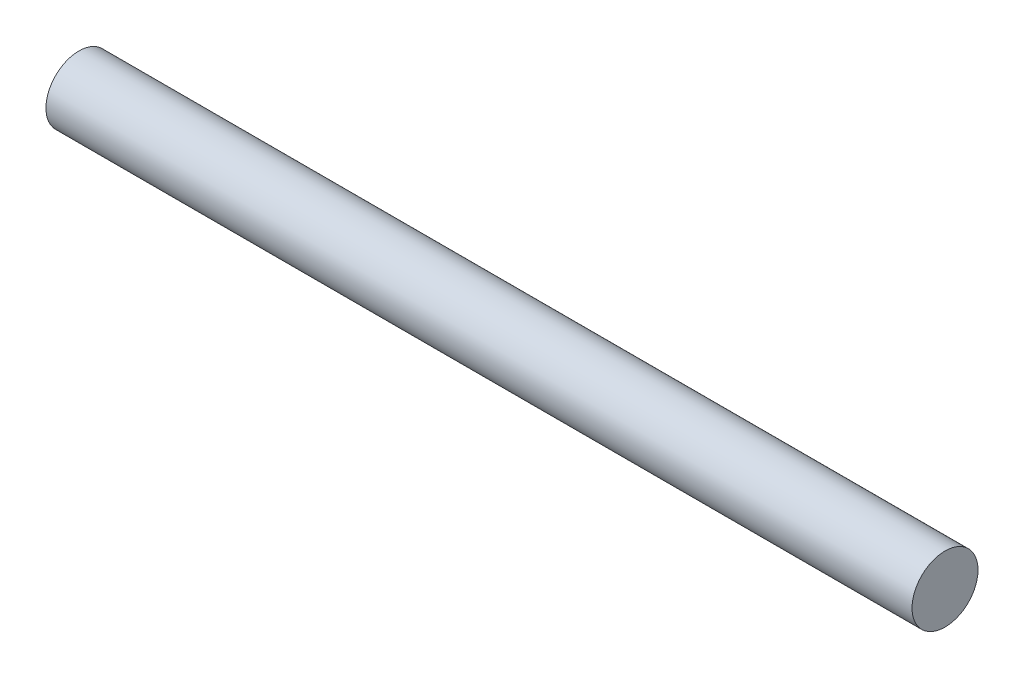
ISO-10303-21;
HEADER;
FILE_DESCRIPTION(('STEP AP214'),'2;1');
FILE_NAME('part.step','',(''),(''),'','','');
FILE_SCHEMA(('AUTOMOTIVE_DESIGN { 1 0 10303 214 1 1 1 1 }'));
ENDSEC;
DATA;
#1=APPLICATION_CONTEXT('core data for automotive mechanical design processes');
#2=APPLICATION_PROTOCOL_DEFINITION('international standard','automotive_design',2000,#1);
#3=PRODUCT_CONTEXT('',#1,'mechanical');
#4=PRODUCT('Part','Part','',(#3));
#5=PRODUCT_RELATED_PRODUCT_CATEGORY('part','',(#4));
#6=PRODUCT_DEFINITION_FORMATION('','',#4);
#7=PRODUCT_DEFINITION_CONTEXT('part definition',#1,'design');
#8=PRODUCT_DEFINITION('design','',#6,#7);
#9=PRODUCT_DEFINITION_SHAPE('','',#8);
#10=(LENGTH_UNIT() NAMED_UNIT(*) SI_UNIT(.MILLI.,.METRE.));
#11=(NAMED_UNIT(*) PLANE_ANGLE_UNIT() SI_UNIT($,.RADIAN.));
#12=(NAMED_UNIT(*) SI_UNIT($,.STERADIAN.) SOLID_ANGLE_UNIT());
#13=UNCERTAINTY_MEASURE_WITH_UNIT(LENGTH_MEASURE(1.E-05),#10,'distance_accuracy_value','');
#14=(GEOMETRIC_REPRESENTATION_CONTEXT(3) GLOBAL_UNCERTAINTY_ASSIGNED_CONTEXT((#13)) GLOBAL_UNIT_ASSIGNED_CONTEXT((#10,
#11,#12)) REPRESENTATION_CONTEXT('',''));
#15=CARTESIAN_POINT('',(0.,0.,0.));
#16=DIRECTION('',(0.,0.,1.));
#17=DIRECTION('',(1.,0.,0.));
#18=AXIS2_PLACEMENT_3D('',#15,#16,#17);
#19=CARTESIAN_POINT('',(105.,0.,0.));
#20=DIRECTION('',(-1.,0.,0.));
#21=DIRECTION('',(0.,0.,1.));
#22=AXIS2_PLACEMENT_3D('',#19,#20,#21);
#23=CYLINDRICAL_SURFACE('',#22,4.);
#24=CARTESIAN_POINT('',(105.,0.,0.));
#25=DIRECTION('',(1.,0.,0.));
#26=DIRECTION('',(0.,0.,-1.));
#27=AXIS2_PLACEMENT_3D('',#24,#25,#26);
#28=CIRCLE('',#27,4.);
#29=CARTESIAN_POINT('',(105.,0.,-4.));
#30=VERTEX_POINT('',#29);
#31=EDGE_CURVE('E10',#30,#30,#28,.T.);
#32=ORIENTED_EDGE('',*,*,#31,.F.);
#33=EDGE_LOOP('',(#32));
#34=FACE_BOUND('',#33,.T.);
#35=CARTESIAN_POINT('',(0.,0.,0.));
#36=DIRECTION('',(1.,0.,0.));
#37=DIRECTION('',(0.,0.,-1.));
#38=AXIS2_PLACEMENT_3D('',#35,#36,#37);
#39=CIRCLE('',#38,4.);
#40=CARTESIAN_POINT('',(0.,0.,-4.));
#41=VERTEX_POINT('',#40);
#42=EDGE_CURVE('E36',#41,#41,#39,.T.);
#43=ORIENTED_EDGE('',*,*,#42,.T.);
#44=EDGE_LOOP('',(#43));
#45=FACE_BOUND('',#44,.T.);
#46=ADVANCED_FACE('F33',(#34,#45),#23,.T.);
#47=CARTESIAN_POINT('',(105.,0.,0.));
#48=DIRECTION('',(1.,0.,0.));
#49=DIRECTION('',(0.,0.,-1.));
#50=AXIS2_PLACEMENT_3D('',#47,#48,#49);
#51=PLANE('',#50);
#52=ORIENTED_EDGE('',*,*,#31,.T.);
#53=EDGE_LOOP('',(#52));
#54=FACE_BOUND('',#53,.T.);
#55=ADVANCED_FACE('F48',(#54),#51,.T.);
#56=CARTESIAN_POINT('',(0.,0.,0.));
#57=DIRECTION('',(1.,0.,0.));
#58=DIRECTION('',(0.,0.,-1.));
#59=AXIS2_PLACEMENT_3D('',#56,#57,#58);
#60=PLANE('',#59);
#61=ORIENTED_EDGE('',*,*,#42,.F.);
#62=EDGE_LOOP('',(#61));
#63=FACE_BOUND('',#62,.T.);
#64=ADVANCED_FACE('F46',(#63),#60,.F.);
#65=CLOSED_SHELL('',(#46,#55,#64));
#66=MANIFOLD_SOLID_BREP('B2',#65);
#67=ADVANCED_BREP_SHAPE_REPRESENTATION('',(#18,#66),#14);
#68=SHAPE_DEFINITION_REPRESENTATION(#9,#67);
ENDSEC;
END-ISO-10303-21;
